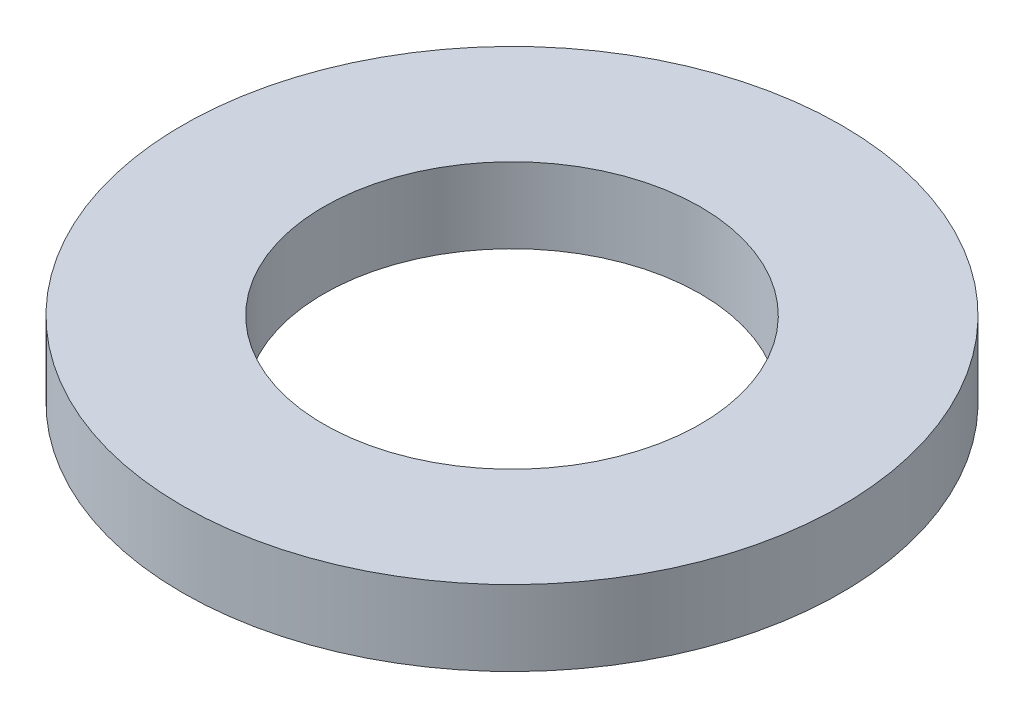
ISO-10303-21;
HEADER;
FILE_DESCRIPTION(('STEP AP214'),'2;1');
FILE_NAME('part.step','',(''),(''),'','','');
FILE_SCHEMA(('AUTOMOTIVE_DESIGN { 1 0 10303 214 1 1 1 1 }'));
ENDSEC;
DATA;
#1=APPLICATION_CONTEXT('core data for automotive mechanical design processes');
#2=APPLICATION_PROTOCOL_DEFINITION('international standard','automotive_design',2000,#1);
#3=PRODUCT_CONTEXT('',#1,'mechanical');
#4=PRODUCT('Part','Part','',(#3));
#5=PRODUCT_RELATED_PRODUCT_CATEGORY('part','',(#4));
#6=PRODUCT_DEFINITION_FORMATION('','',#4);
#7=PRODUCT_DEFINITION_CONTEXT('part definition',#1,'design');
#8=PRODUCT_DEFINITION('design','',#6,#7);
#9=PRODUCT_DEFINITION_SHAPE('','',#8);
#10=(LENGTH_UNIT() NAMED_UNIT(*) SI_UNIT(.MILLI.,.METRE.));
#11=(NAMED_UNIT(*) PLANE_ANGLE_UNIT() SI_UNIT($,.RADIAN.));
#12=(NAMED_UNIT(*) SI_UNIT($,.STERADIAN.) SOLID_ANGLE_UNIT());
#13=UNCERTAINTY_MEASURE_WITH_UNIT(LENGTH_MEASURE(1.E-05),#10,'distance_accuracy_value','');
#14=(GEOMETRIC_REPRESENTATION_CONTEXT(3) GLOBAL_UNCERTAINTY_ASSIGNED_CONTEXT((#13)) GLOBAL_UNIT_ASSIGNED_CONTEXT((#10,
#11,#12)) REPRESENTATION_CONTEXT('',''));
#15=CARTESIAN_POINT('',(0.,0.,0.));
#16=DIRECTION('',(0.,0.,1.));
#17=DIRECTION('',(1.,0.,0.));
#18=AXIS2_PLACEMENT_3D('',#15,#16,#17);
#19=CARTESIAN_POINT('',(4.,0.,0.));
#20=DIRECTION('',(0.,-1.,0.));
#21=DIRECTION('',(0.,0.,-1.));
#22=AXIS2_PLACEMENT_3D('',#19,#20,#21);
#23=PLANE('',#22);
#24=CARTESIAN_POINT('',(0.,0.,0.));
#25=DIRECTION('',(0.,-1.,0.));
#26=DIRECTION('',(0.,0.,-1.));
#27=AXIS2_PLACEMENT_3D('',#24,#25,#26);
#28=CIRCLE('',#27,7.);
#29=CARTESIAN_POINT('',(0.,0.,-7.));
#30=VERTEX_POINT('',#29);
#31=EDGE_CURVE('E10',#30,#30,#28,.T.);
#32=ORIENTED_EDGE('',*,*,#31,.T.);
#33=EDGE_LOOP('',(#32));
#34=FACE_BOUND('',#33,.T.);
#35=CARTESIAN_POINT('',(0.,0.,0.));
#36=DIRECTION('',(0.,-1.,0.));
#37=DIRECTION('',(0.,0.,-1.));
#38=AXIS2_PLACEMENT_3D('',#35,#36,#37);
#39=CIRCLE('',#38,4.);
#40=CARTESIAN_POINT('',(0.,0.,-4.));
#41=VERTEX_POINT('',#40);
#42=EDGE_CURVE('E45',#41,#41,#39,.T.);
#43=ORIENTED_EDGE('',*,*,#42,.F.);
#44=EDGE_LOOP('',(#43));
#45=FACE_BOUND('',#44,.T.);
#46=ADVANCED_FACE('F31',(#34,#45),#23,.T.);
#47=CARTESIAN_POINT('',(0.,1.6,0.));
#48=DIRECTION('',(0.,-1.,0.));
#49=DIRECTION('',(0.,0.,-1.));
#50=AXIS2_PLACEMENT_3D('',#47,#48,#49);
#51=CYLINDRICAL_SURFACE('',#50,7.);
#52=CARTESIAN_POINT('',(0.,1.6,0.));
#53=DIRECTION('',(0.,-1.,0.));
#54=DIRECTION('',(0.,0.,-1.));
#55=AXIS2_PLACEMENT_3D('',#52,#53,#54);
#56=CIRCLE('',#55,7.);
#57=CARTESIAN_POINT('',(0.,1.6,-7.));
#58=VERTEX_POINT('',#57);
#59=EDGE_CURVE('E37',#58,#58,#56,.T.);
#60=ORIENTED_EDGE('',*,*,#59,.T.);
#61=EDGE_LOOP('',(#60));
#62=FACE_BOUND('',#61,.T.);
#63=ORIENTED_EDGE('',*,*,#31,.F.);
#64=EDGE_LOOP('',(#63));
#65=FACE_BOUND('',#64,.T.);
#66=ADVANCED_FACE('F55',(#62,#65),#51,.T.);
#67=CARTESIAN_POINT('',(7.,1.6,0.));
#68=DIRECTION('',(0.,1.,0.));
#69=DIRECTION('',(0.,0.,1.));
#70=AXIS2_PLACEMENT_3D('',#67,#68,#69);
#71=PLANE('',#70);
#72=CARTESIAN_POINT('',(0.,1.6,0.));
#73=DIRECTION('',(0.,-1.,0.));
#74=DIRECTION('',(0.,0.,-1.));
#75=AXIS2_PLACEMENT_3D('',#72,#73,#74);
#76=CIRCLE('',#75,4.);
#77=CARTESIAN_POINT('',(0.,1.6,-4.));
#78=VERTEX_POINT('',#77);
#79=EDGE_CURVE('E41',#78,#78,#76,.T.);
#80=ORIENTED_EDGE('',*,*,#79,.T.);
#81=EDGE_LOOP('',(#80));
#82=FACE_BOUND('',#81,.T.);
#83=ORIENTED_EDGE('',*,*,#59,.F.);
#84=EDGE_LOOP('',(#83));
#85=FACE_BOUND('',#84,.T.);
#86=ADVANCED_FACE('F59',(#82,#85),#71,.T.);
#87=CARTESIAN_POINT('',(0.,1.6,0.));
#88=DIRECTION('',(0.,-1.,0.));
#89=DIRECTION('',(0.,0.,-1.));
#90=AXIS2_PLACEMENT_3D('',#87,#88,#89);
#91=CYLINDRICAL_SURFACE('',#90,4.);
#92=ORIENTED_EDGE('',*,*,#42,.T.);
#93=EDGE_LOOP('',(#92));
#94=FACE_BOUND('',#93,.T.);
#95=ORIENTED_EDGE('',*,*,#79,.F.);
#96=EDGE_LOOP('',(#95));
#97=FACE_BOUND('',#96,.T.);
#98=ADVANCED_FACE('F51',(#94,#97),#91,.F.);
#99=CLOSED_SHELL('',(#46,#66,#86,#98));
#100=MANIFOLD_SOLID_BREP('B2',#99);
#101=ADVANCED_BREP_SHAPE_REPRESENTATION('',(#18,#100),#14);
#102=SHAPE_DEFINITION_REPRESENTATION(#9,#101);
ENDSEC;
END-ISO-10303-21;
